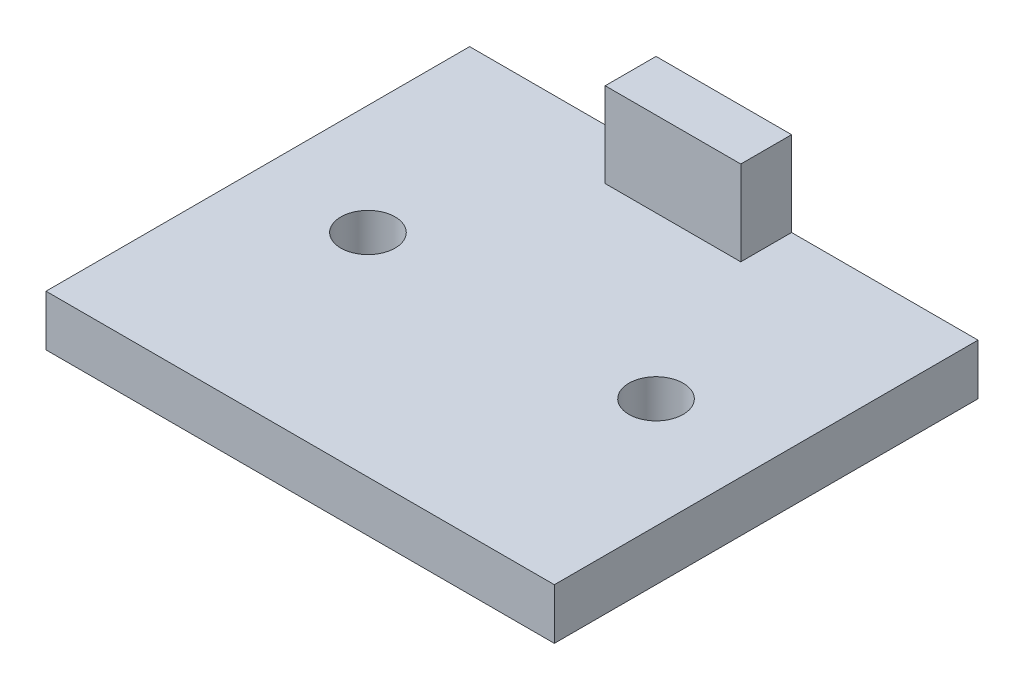
ISO-10303-21;
HEADER;
FILE_DESCRIPTION(('STEP AP214'),'2;1');
FILE_NAME('part.step','',(''),(''),'','','');
FILE_SCHEMA(('AUTOMOTIVE_DESIGN { 1 0 10303 214 1 1 1 1 }'));
ENDSEC;
DATA;
#1=APPLICATION_CONTEXT('core data for automotive mechanical design processes');
#2=APPLICATION_PROTOCOL_DEFINITION('international standard','automotive_design',2000,#1);
#3=PRODUCT_CONTEXT('',#1,'mechanical');
#4=PRODUCT('Part','Part','',(#3));
#5=PRODUCT_RELATED_PRODUCT_CATEGORY('part','',(#4));
#6=PRODUCT_DEFINITION_FORMATION('','',#4);
#7=PRODUCT_DEFINITION_CONTEXT('part definition',#1,'design');
#8=PRODUCT_DEFINITION('design','',#6,#7);
#9=PRODUCT_DEFINITION_SHAPE('','',#8);
#10=(LENGTH_UNIT() NAMED_UNIT(*) SI_UNIT(.MILLI.,.METRE.));
#11=(NAMED_UNIT(*) PLANE_ANGLE_UNIT() SI_UNIT($,.RADIAN.));
#12=(NAMED_UNIT(*) SI_UNIT($,.STERADIAN.) SOLID_ANGLE_UNIT());
#13=UNCERTAINTY_MEASURE_WITH_UNIT(LENGTH_MEASURE(1.E-05),#10,'distance_accuracy_value','');
#14=(GEOMETRIC_REPRESENTATION_CONTEXT(3) GLOBAL_UNCERTAINTY_ASSIGNED_CONTEXT((#13)) GLOBAL_UNIT_ASSIGNED_CONTEXT((#10,
#11,#12)) REPRESENTATION_CONTEXT('',''));
#15=CARTESIAN_POINT('',(0.,0.,0.));
#16=DIRECTION('',(0.,0.,1.));
#17=DIRECTION('',(1.,0.,0.));
#18=AXIS2_PLACEMENT_3D('',#15,#16,#17);
#19=CARTESIAN_POINT('',(-22.2906403940887,3.,-14.6551724137931));
#20=DIRECTION('',(1.,0.,0.));
#21=DIRECTION('',(0.,0.,-1.));
#22=AXIS2_PLACEMENT_3D('',#19,#20,#21);
#23=PLANE('',#22);
#24=DIRECTION('',(0.,0.,1.));
#25=VECTOR('',#24,1.);
#26=CARTESIAN_POINT('',(-22.2906403940887,0.,-14.6551724137931));
#27=LINE('',#26,#25);
#28=CARTESIAN_POINT('',(-22.2906403940887,0.,-14.6551724137931));
#29=VERTEX_POINT('',#28);
#30=CARTESIAN_POINT('',(-22.2906403940887,0.,10.3448275862069));
#31=VERTEX_POINT('',#30);
#32=EDGE_CURVE('E153',#29,#31,#27,.T.);
#33=ORIENTED_EDGE('',*,*,#32,.T.);
#34=DIRECTION('',(0.,-1.,0.));
#35=VECTOR('',#34,1.);
#36=CARTESIAN_POINT('',(-22.2906403940887,3.,10.3448275862069));
#37=LINE('',#36,#35);
#38=CARTESIAN_POINT('',(-22.2906403940887,3.,10.3448275862069));
#39=VERTEX_POINT('',#38);
#40=EDGE_CURVE('E11',#39,#31,#37,.T.);
#41=ORIENTED_EDGE('',*,*,#40,.F.);
#42=DIRECTION('',(0.,0.,1.));
#43=VECTOR('',#42,1.);
#44=CARTESIAN_POINT('',(-22.2906403940887,3.,-14.6551724137931));
#45=LINE('',#44,#43);
#46=CARTESIAN_POINT('',(-22.2906403940887,3.,-14.6551724137931));
#47=VERTEX_POINT('',#46);
#48=EDGE_CURVE('E139',#47,#39,#45,.T.);
#49=ORIENTED_EDGE('',*,*,#48,.F.);
#50=DIRECTION('',(0.,-1.,0.));
#51=VECTOR('',#50,1.);
#52=CARTESIAN_POINT('',(-22.2906403940887,3.,-14.6551724137931));
#53=LINE('',#52,#51);
#54=EDGE_CURVE('E152',#47,#29,#53,.T.);
#55=ORIENTED_EDGE('',*,*,#54,.T.);
#56=EDGE_LOOP('',(#33,#41,#49,#55));
#57=FACE_BOUND('',#56,.T.);
#58=ADVANCED_FACE('F41',(#57),#23,.F.);
#59=CARTESIAN_POINT('',(-22.2906403940887,3.,10.3448275862069));
#60=DIRECTION('',(0.,0.,-1.));
#61=DIRECTION('',(-1.,0.,0.));
#62=AXIS2_PLACEMENT_3D('',#59,#60,#61);
#63=PLANE('',#62);
#64=DIRECTION('',(1.,0.,0.));
#65=VECTOR('',#64,1.);
#66=CARTESIAN_POINT('',(-22.2906403940887,0.,10.3448275862069));
#67=LINE('',#66,#65);
#68=CARTESIAN_POINT('',(7.70935960591128,0.,10.3448275862069));
#69=VERTEX_POINT('',#68);
#70=EDGE_CURVE('E156',#31,#69,#67,.T.);
#71=ORIENTED_EDGE('',*,*,#70,.T.);
#72=DIRECTION('',(0.,-1.,0.));
#73=VECTOR('',#72,1.);
#74=CARTESIAN_POINT('',(7.70935960591128,3.,10.3448275862069));
#75=LINE('',#74,#73);
#76=CARTESIAN_POINT('',(7.70935960591128,3.,10.3448275862069));
#77=VERTEX_POINT('',#76);
#78=EDGE_CURVE('E49',#77,#69,#75,.T.);
#79=ORIENTED_EDGE('',*,*,#78,.F.);
#80=DIRECTION('',(1.,0.,0.));
#81=VECTOR('',#80,1.);
#82=CARTESIAN_POINT('',(-22.2906403940887,3.,10.3448275862069));
#83=LINE('',#82,#81);
#84=EDGE_CURVE('E142',#39,#77,#83,.T.);
#85=ORIENTED_EDGE('',*,*,#84,.F.);
#86=ORIENTED_EDGE('',*,*,#40,.T.);
#87=EDGE_LOOP('',(#71,#79,#85,#86));
#88=FACE_BOUND('',#87,.T.);
#89=ADVANCED_FACE('F189',(#88),#63,.F.);
#90=CARTESIAN_POINT('',(7.70935960591128,3.,-14.6551724137931));
#91=DIRECTION('',(1.,0.,0.));
#92=DIRECTION('',(0.,0.,-1.));
#93=AXIS2_PLACEMENT_3D('',#90,#91,#92);
#94=PLANE('',#93);
#95=DIRECTION('',(0.,0.,1.));
#96=VECTOR('',#95,1.);
#97=CARTESIAN_POINT('',(7.70935960591128,0.,-14.6551724137931));
#98=LINE('',#97,#96);
#99=CARTESIAN_POINT('',(7.70935960591128,0.,-14.6551724137931));
#100=VERTEX_POINT('',#99);
#101=EDGE_CURVE('E159',#100,#69,#98,.T.);
#102=ORIENTED_EDGE('',*,*,#101,.F.);
#103=DIRECTION('',(0.,-1.,0.));
#104=VECTOR('',#103,1.);
#105=CARTESIAN_POINT('',(7.70935960591128,3.,-14.6551724137931));
#106=LINE('',#105,#104);
#107=CARTESIAN_POINT('',(7.70935960591128,3.,-14.6551724137931));
#108=VERTEX_POINT('',#107);
#109=EDGE_CURVE('E165',#108,#100,#106,.T.);
#110=ORIENTED_EDGE('',*,*,#109,.F.);
#111=DIRECTION('',(0.,0.,1.));
#112=VECTOR('',#111,1.);
#113=CARTESIAN_POINT('',(7.70935960591128,3.,-14.6551724137931));
#114=LINE('',#113,#112);
#115=EDGE_CURVE('E145',#108,#77,#114,.T.);
#116=ORIENTED_EDGE('',*,*,#115,.T.);
#117=ORIENTED_EDGE('',*,*,#78,.T.);
#118=EDGE_LOOP('',(#102,#110,#116,#117));
#119=FACE_BOUND('',#118,.T.);
#120=ADVANCED_FACE('F194',(#119),#94,.T.);
#121=CARTESIAN_POINT('',(-22.2906403940887,3.,-14.6551724137931));
#122=DIRECTION('',(0.,0.,-1.));
#123=DIRECTION('',(-1.,0.,0.));
#124=AXIS2_PLACEMENT_3D('',#121,#122,#123);
#125=PLANE('',#124);
#126=DIRECTION('',(1.,0.,0.));
#127=VECTOR('',#126,1.);
#128=CARTESIAN_POINT('',(-22.2906403940887,0.,-14.6551724137931));
#129=LINE('',#128,#127);
#130=EDGE_CURVE('E143',#29,#100,#129,.T.);
#131=ORIENTED_EDGE('',*,*,#130,.F.);
#132=ORIENTED_EDGE('',*,*,#54,.F.);
#133=DIRECTION('',(1.,0.,0.));
#134=VECTOR('',#133,1.);
#135=CARTESIAN_POINT('',(-22.2906403940887,3.,-14.6551724137931));
#136=LINE('',#135,#134);
#137=CARTESIAN_POINT('',(-11.2906403940887,3.,-14.6551724137931));
#138=VERTEX_POINT('',#137);
#139=EDGE_CURVE('E149',#47,#138,#136,.T.);
#140=ORIENTED_EDGE('',*,*,#139,.T.);
#141=DIRECTION('',(0.,-1.,0.));
#142=VECTOR('',#141,1.);
#143=CARTESIAN_POINT('',(-11.2906403940887,8.,-14.6551724137931));
#144=LINE('',#143,#142);
#145=CARTESIAN_POINT('',(-11.2906403940887,8.,-14.6551724137931));
#146=VERTEX_POINT('',#145);
#147=EDGE_CURVE('E132',#146,#138,#144,.T.);
#148=ORIENTED_EDGE('',*,*,#147,.F.);
#149=DIRECTION('',(-1.,0.,0.));
#150=VECTOR('',#149,1.);
#151=CARTESIAN_POINT('',(-11.2906403940887,8.,-14.6551724137931));
#152=LINE('',#151,#150);
#153=CARTESIAN_POINT('',(-3.29064039408872,8.,-14.6551724137931));
#154=VERTEX_POINT('',#153);
#155=EDGE_CURVE('E114',#154,#146,#152,.T.);
#156=ORIENTED_EDGE('',*,*,#155,.F.);
#157=DIRECTION('',(0.,-1.,0.));
#158=VECTOR('',#157,1.);
#159=CARTESIAN_POINT('',(-3.29064039408872,8.,-14.6551724137931));
#160=LINE('',#159,#158);
#161=CARTESIAN_POINT('',(-3.29064039408872,3.,-14.6551724137931));
#162=VERTEX_POINT('',#161);
#163=EDGE_CURVE('E111',#154,#162,#160,.T.);
#164=ORIENTED_EDGE('',*,*,#163,.T.);
#165=EDGE_CURVE('E148',#162,#108,#136,.T.);
#166=ORIENTED_EDGE('',*,*,#165,.T.);
#167=ORIENTED_EDGE('',*,*,#109,.T.);
#168=EDGE_LOOP('',(#131,#132,#140,#148,#156,#164,#166,#167));
#169=FACE_BOUND('',#168,.T.);
#170=ADVANCED_FACE('F202',(#169),#125,.T.);
#171=CARTESIAN_POINT('',(0.,3.,0.));
#172=DIRECTION('',(0.,1.,0.));
#173=DIRECTION('',(0.,0.,1.));
#174=AXIS2_PLACEMENT_3D('',#171,#172,#173);
#175=PLANE('',#174);
#176=DIRECTION('',(0.,0.,1.));
#177=VECTOR('',#176,1.);
#178=CARTESIAN_POINT('',(-11.2906403940887,3.,-11.6551724137931));
#179=LINE('',#178,#177);
#180=CARTESIAN_POINT('',(-11.2906403940887,3.,-11.6551724137931));
#181=VERTEX_POINT('',#180);
#182=EDGE_CURVE('E124',#138,#181,#179,.T.);
#183=ORIENTED_EDGE('',*,*,#182,.F.);
#184=ORIENTED_EDGE('',*,*,#139,.F.);
#185=ORIENTED_EDGE('',*,*,#48,.T.);
#186=ORIENTED_EDGE('',*,*,#84,.T.);
#187=ORIENTED_EDGE('',*,*,#115,.F.);
#188=ORIENTED_EDGE('',*,*,#165,.F.);
#189=DIRECTION('',(0.,0.,-1.));
#190=VECTOR('',#189,1.);
#191=CARTESIAN_POINT('',(-3.29064039408872,3.,-11.6551724137931));
#192=LINE('',#191,#190);
#193=CARTESIAN_POINT('',(-3.29064039408872,3.,-11.6551724137931));
#194=VERTEX_POINT('',#193);
#195=EDGE_CURVE('E62',#194,#162,#192,.T.);
#196=ORIENTED_EDGE('',*,*,#195,.F.);
#197=DIRECTION('',(1.,0.,0.));
#198=VECTOR('',#197,1.);
#199=CARTESIAN_POINT('',(-11.2906403940887,3.,-11.6551724137931));
#200=LINE('',#199,#198);
#201=EDGE_CURVE('E57',#181,#194,#200,.T.);
#202=ORIENTED_EDGE('',*,*,#201,.F.);
#203=EDGE_LOOP('',(#183,#184,#185,#186,#187,#188,#196,#202));
#204=FACE_BOUND('',#203,.T.);
#205=CARTESIAN_POINT('',(-15.7906403940887,3.,-2.1551724137931));
#206=DIRECTION('',(0.,1.,0.));
#207=DIRECTION('',(0.,0.,1.));
#208=AXIS2_PLACEMENT_3D('',#205,#206,#207);
#209=CIRCLE('',#208,1.6);
#210=CARTESIAN_POINT('',(-15.7906403940887,3.,-0.555172413793101));
#211=VERTEX_POINT('',#210);
#212=EDGE_CURVE('E130',#211,#211,#209,.T.);
#213=ORIENTED_EDGE('',*,*,#212,.F.);
#214=EDGE_LOOP('',(#213));
#215=FACE_BOUND('',#214,.T.);
#216=CARTESIAN_POINT('',(1.20935960591128,3.,-2.1551724137931));
#217=DIRECTION('',(0.,1.,0.));
#218=DIRECTION('',(0.,0.,1.));
#219=AXIS2_PLACEMENT_3D('',#216,#217,#218);
#220=CIRCLE('',#219,1.6);
#221=CARTESIAN_POINT('',(1.20935960591128,3.,-0.555172413793102));
#222=VERTEX_POINT('',#221);
#223=EDGE_CURVE('E127',#222,#222,#220,.T.);
#224=ORIENTED_EDGE('',*,*,#223,.F.);
#225=EDGE_LOOP('',(#224));
#226=FACE_BOUND('',#225,.T.);
#227=ADVANCED_FACE('F209',(#204,#215,#226),#175,.T.);
#228=CARTESIAN_POINT('',(0.,0.,0.));
#229=DIRECTION('',(0.,1.,0.));
#230=DIRECTION('',(0.,0.,1.));
#231=AXIS2_PLACEMENT_3D('',#228,#229,#230);
#232=PLANE('',#231);
#233=CARTESIAN_POINT('',(-15.7906403940887,0.,-2.1551724137931));
#234=DIRECTION('',(0.,1.,0.));
#235=DIRECTION('',(0.,0.,1.));
#236=AXIS2_PLACEMENT_3D('',#233,#234,#235);
#237=CIRCLE('',#236,1.6);
#238=CARTESIAN_POINT('',(-15.7906403940887,0.,-0.555172413793101));
#239=VERTEX_POINT('',#238);
#240=EDGE_CURVE('E44',#239,#239,#237,.T.);
#241=ORIENTED_EDGE('',*,*,#240,.T.);
#242=EDGE_LOOP('',(#241));
#243=FACE_BOUND('',#242,.T.);
#244=CARTESIAN_POINT('',(1.20935960591128,0.,-2.1551724137931));
#245=DIRECTION('',(0.,1.,0.));
#246=DIRECTION('',(0.,0.,1.));
#247=AXIS2_PLACEMENT_3D('',#244,#245,#246);
#248=CIRCLE('',#247,1.6);
#249=CARTESIAN_POINT('',(1.20935960591128,0.,-0.555172413793102));
#250=VERTEX_POINT('',#249);
#251=EDGE_CURVE('E137',#250,#250,#248,.T.);
#252=ORIENTED_EDGE('',*,*,#251,.T.);
#253=EDGE_LOOP('',(#252));
#254=FACE_BOUND('',#253,.T.);
#255=ORIENTED_EDGE('',*,*,#32,.F.);
#256=ORIENTED_EDGE('',*,*,#130,.T.);
#257=ORIENTED_EDGE('',*,*,#101,.T.);
#258=ORIENTED_EDGE('',*,*,#70,.F.);
#259=EDGE_LOOP('',(#255,#256,#257,#258));
#260=FACE_BOUND('',#259,.T.);
#261=ADVANCED_FACE('F173',(#243,#254,#260),#232,.F.);
#262=CARTESIAN_POINT('',(1.20935960591128,-7.,-2.1551724137931));
#263=DIRECTION('',(0.,1.,0.));
#264=DIRECTION('',(0.,0.,1.));
#265=AXIS2_PLACEMENT_3D('',#262,#263,#264);
#266=CYLINDRICAL_SURFACE('',#265,1.6);
#267=ORIENTED_EDGE('',*,*,#223,.T.);
#268=EDGE_LOOP('',(#267));
#269=FACE_BOUND('',#268,.T.);
#270=ORIENTED_EDGE('',*,*,#251,.F.);
#271=EDGE_LOOP('',(#270));
#272=FACE_BOUND('',#271,.T.);
#273=ADVANCED_FACE('F177',(#269,#272),#266,.F.);
#274=CARTESIAN_POINT('',(-15.7906403940887,-7.,-2.1551724137931));
#275=DIRECTION('',(0.,1.,0.));
#276=DIRECTION('',(0.,0.,1.));
#277=AXIS2_PLACEMENT_3D('',#274,#275,#276);
#278=CYLINDRICAL_SURFACE('',#277,1.6);
#279=ORIENTED_EDGE('',*,*,#212,.T.);
#280=EDGE_LOOP('',(#279));
#281=FACE_BOUND('',#280,.T.);
#282=ORIENTED_EDGE('',*,*,#240,.F.);
#283=EDGE_LOOP('',(#282));
#284=FACE_BOUND('',#283,.T.);
#285=ADVANCED_FACE('F175',(#281,#284),#278,.F.);
#286=CARTESIAN_POINT('',(-11.2906403940887,8.,-11.6551724137931));
#287=DIRECTION('',(0.,0.,-1.));
#288=DIRECTION('',(-1.,0.,0.));
#289=AXIS2_PLACEMENT_3D('',#286,#287,#288);
#290=PLANE('',#289);
#291=ORIENTED_EDGE('',*,*,#201,.T.);
#292=DIRECTION('',(0.,-1.,0.));
#293=VECTOR('',#292,1.);
#294=CARTESIAN_POINT('',(-3.29064039408872,8.,-11.6551724137931));
#295=LINE('',#294,#293);
#296=CARTESIAN_POINT('',(-3.29064039408872,8.,-11.6551724137931));
#297=VERTEX_POINT('',#296);
#298=EDGE_CURVE('E109',#297,#194,#295,.T.);
#299=ORIENTED_EDGE('',*,*,#298,.F.);
#300=DIRECTION('',(1.,0.,0.));
#301=VECTOR('',#300,1.);
#302=CARTESIAN_POINT('',(-11.2906403940887,8.,-11.6551724137931));
#303=LINE('',#302,#301);
#304=CARTESIAN_POINT('',(-11.2906403940887,8.,-11.6551724137931));
#305=VERTEX_POINT('',#304);
#306=EDGE_CURVE('E115',#305,#297,#303,.T.);
#307=ORIENTED_EDGE('',*,*,#306,.F.);
#308=DIRECTION('',(0.,-1.,0.));
#309=VECTOR('',#308,1.);
#310=CARTESIAN_POINT('',(-11.2906403940887,8.,-11.6551724137931));
#311=LINE('',#310,#309);
#312=EDGE_CURVE('E215',#305,#181,#311,.T.);
#313=ORIENTED_EDGE('',*,*,#312,.T.);
#314=EDGE_LOOP('',(#291,#299,#307,#313));
#315=FACE_BOUND('',#314,.T.);
#316=ADVANCED_FACE('F126',(#315),#290,.F.);
#317=CARTESIAN_POINT('',(-3.29064039408872,8.,-11.6551724137931));
#318=DIRECTION('',(-1.,0.,0.));
#319=DIRECTION('',(0.,0.,1.));
#320=AXIS2_PLACEMENT_3D('',#317,#318,#319);
#321=PLANE('',#320);
#322=ORIENTED_EDGE('',*,*,#195,.T.);
#323=ORIENTED_EDGE('',*,*,#163,.F.);
#324=DIRECTION('',(0.,0.,-1.));
#325=VECTOR('',#324,1.);
#326=CARTESIAN_POINT('',(-3.29064039408872,8.,-11.6551724137931));
#327=LINE('',#326,#325);
#328=EDGE_CURVE('E105',#297,#154,#327,.T.);
#329=ORIENTED_EDGE('',*,*,#328,.F.);
#330=ORIENTED_EDGE('',*,*,#298,.T.);
#331=EDGE_LOOP('',(#322,#323,#329,#330));
#332=FACE_BOUND('',#331,.T.);
#333=ADVANCED_FACE('F107',(#332),#321,.F.);
#334=CARTESIAN_POINT('',(-11.2906403940887,8.,-11.6551724137931));
#335=DIRECTION('',(1.,0.,0.));
#336=DIRECTION('',(0.,0.,-1.));
#337=AXIS2_PLACEMENT_3D('',#334,#335,#336);
#338=PLANE('',#337);
#339=ORIENTED_EDGE('',*,*,#182,.T.);
#340=ORIENTED_EDGE('',*,*,#312,.F.);
#341=DIRECTION('',(0.,0.,1.));
#342=VECTOR('',#341,1.);
#343=CARTESIAN_POINT('',(-11.2906403940887,8.,-11.6551724137931));
#344=LINE('',#343,#342);
#345=EDGE_CURVE('E120',#146,#305,#344,.T.);
#346=ORIENTED_EDGE('',*,*,#345,.F.);
#347=ORIENTED_EDGE('',*,*,#147,.T.);
#348=EDGE_LOOP('',(#339,#340,#346,#347));
#349=FACE_BOUND('',#348,.T.);
#350=ADVANCED_FACE('F214',(#349),#338,.F.);
#351=CARTESIAN_POINT('',(0.,8.,0.));
#352=DIRECTION('',(0.,1.,0.));
#353=DIRECTION('',(0.,0.,1.));
#354=AXIS2_PLACEMENT_3D('',#351,#352,#353);
#355=PLANE('',#354);
#356=ORIENTED_EDGE('',*,*,#306,.T.);
#357=ORIENTED_EDGE('',*,*,#328,.T.);
#358=ORIENTED_EDGE('',*,*,#155,.T.);
#359=ORIENTED_EDGE('',*,*,#345,.T.);
#360=EDGE_LOOP('',(#356,#357,#358,#359));
#361=FACE_BOUND('',#360,.T.);
#362=ADVANCED_FACE('F118',(#361),#355,.T.);
#363=CLOSED_SHELL('',(#58,#89,#120,#170,#227,#261,#273,#285,#316,#333,#350,#362));
#364=MANIFOLD_SOLID_BREP('B2',#363);
#365=ADVANCED_BREP_SHAPE_REPRESENTATION('',(#18,#364),#14);
#366=SHAPE_DEFINITION_REPRESENTATION(#9,#365);
ENDSEC;
END-ISO-10303-21;
